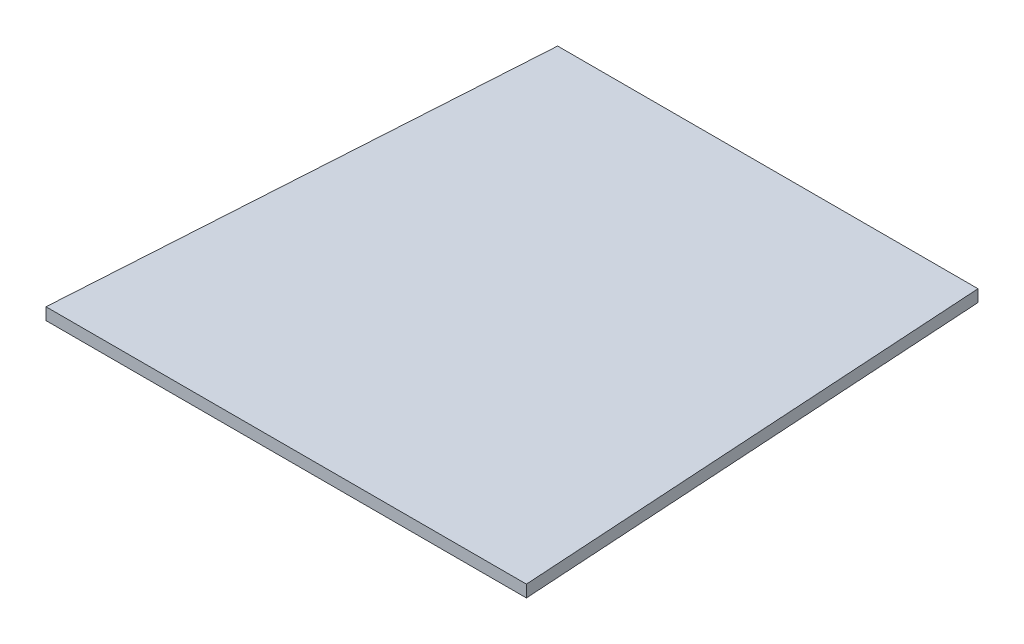
ISO-10303-21;
HEADER;
FILE_DESCRIPTION(('STEP AP214'),'2;1');
FILE_NAME('part.step','',(''),(''),'','','');
FILE_SCHEMA(('AUTOMOTIVE_DESIGN { 1 0 10303 214 1 1 1 1 }'));
ENDSEC;
DATA;
#1=APPLICATION_CONTEXT('core data for automotive mechanical design processes');
#2=APPLICATION_PROTOCOL_DEFINITION('international standard','automotive_design',2000,#1);
#3=PRODUCT_CONTEXT('',#1,'mechanical');
#4=PRODUCT('Part','Part','',(#3));
#5=PRODUCT_RELATED_PRODUCT_CATEGORY('part','',(#4));
#6=PRODUCT_DEFINITION_FORMATION('','',#4);
#7=PRODUCT_DEFINITION_CONTEXT('part definition',#1,'design');
#8=PRODUCT_DEFINITION('design','',#6,#7);
#9=PRODUCT_DEFINITION_SHAPE('','',#8);
#10=(LENGTH_UNIT() NAMED_UNIT(*) SI_UNIT(.MILLI.,.METRE.));
#11=(NAMED_UNIT(*) PLANE_ANGLE_UNIT() SI_UNIT($,.RADIAN.));
#12=(NAMED_UNIT(*) SI_UNIT($,.STERADIAN.) SOLID_ANGLE_UNIT());
#13=UNCERTAINTY_MEASURE_WITH_UNIT(LENGTH_MEASURE(1.E-05),#10,'distance_accuracy_value','');
#14=(GEOMETRIC_REPRESENTATION_CONTEXT(3) GLOBAL_UNCERTAINTY_ASSIGNED_CONTEXT((#13)) GLOBAL_UNIT_ASSIGNED_CONTEXT((#10,
#11,#12)) REPRESENTATION_CONTEXT('',''));
#15=CARTESIAN_POINT('',(0.,0.,0.));
#16=DIRECTION('',(0.,0.,1.));
#17=DIRECTION('',(1.,0.,0.));
#18=AXIS2_PLACEMENT_3D('',#15,#16,#17);
#19=CARTESIAN_POINT('',(200.,10.,138.961038961039));
#20=DIRECTION('',(0.,0.,-1.));
#21=DIRECTION('',(-1.,0.,0.));
#22=AXIS2_PLACEMENT_3D('',#19,#20,#21);
#23=PLANE('',#22);
#24=DIRECTION('',(1.,0.,0.));
#25=VECTOR('',#24,1.);
#26=CARTESIAN_POINT('',(200.,0.,138.961038961039));
#27=LINE('',#26,#25);
#28=CARTESIAN_POINT('',(-200.,0.,138.961038961039));
#29=VERTEX_POINT('',#28);
#30=CARTESIAN_POINT('',(200.,0.,138.961038961039));
#31=VERTEX_POINT('',#30);
#32=EDGE_CURVE('E125',#29,#31,#27,.T.);
#33=ORIENTED_EDGE('',*,*,#32,.T.);
#34=DIRECTION('',(0.,-1.,0.));
#35=VECTOR('',#34,1.);
#36=CARTESIAN_POINT('',(200.,10.,138.961038961039));
#37=LINE('',#36,#35);
#38=CARTESIAN_POINT('',(200.,10.,138.961038961039));
#39=VERTEX_POINT('',#38);
#40=EDGE_CURVE('E11',#39,#31,#37,.T.);
#41=ORIENTED_EDGE('',*,*,#40,.F.);
#42=DIRECTION('',(1.,0.,0.));
#43=VECTOR('',#42,1.);
#44=CARTESIAN_POINT('',(200.,10.,138.961038961039));
#45=LINE('',#44,#43);
#46=CARTESIAN_POINT('',(-200.,10.,138.961038961039));
#47=VERTEX_POINT('',#46);
#48=EDGE_CURVE('E107',#47,#39,#45,.T.);
#49=ORIENTED_EDGE('',*,*,#48,.F.);
#50=DIRECTION('',(0.,-1.,0.));
#51=VECTOR('',#50,1.);
#52=CARTESIAN_POINT('',(-200.,10.,138.961038961039));
#53=LINE('',#52,#51);
#54=EDGE_CURVE('E121',#47,#29,#53,.T.);
#55=ORIENTED_EDGE('',*,*,#54,.T.);
#56=EDGE_LOOP('',(#33,#41,#49,#55));
#57=FACE_BOUND('',#56,.T.);
#58=ADVANCED_FACE('F47',(#57),#23,.F.);
#59=CARTESIAN_POINT('',(175.,10.,-262.038961038961));
#60=DIRECTION('',(-0.998062251019588,0.,0.0622233323578299));
#61=DIRECTION('',(0.0622233323578299,0.,0.998062251019588));
#62=AXIS2_PLACEMENT_3D('',#59,#60,#61);
#63=PLANE('',#62);
#64=DIRECTION('',(-0.0622233323578299,0.,-0.998062251019588));
#65=VECTOR('',#64,1.);
#66=CARTESIAN_POINT('',(175.,0.,-262.038961038961));
#67=LINE('',#66,#65);
#68=CARTESIAN_POINT('',(175.,0.,-262.038961038961));
#69=VERTEX_POINT('',#68);
#70=EDGE_CURVE('E112',#31,#69,#67,.T.);
#71=ORIENTED_EDGE('',*,*,#70,.T.);
#72=DIRECTION('',(0.,-1.,0.));
#73=VECTOR('',#72,1.);
#74=CARTESIAN_POINT('',(175.,10.,-262.038961038961));
#75=LINE('',#74,#73);
#76=CARTESIAN_POINT('',(175.,10.,-262.038961038961));
#77=VERTEX_POINT('',#76);
#78=EDGE_CURVE('E56',#77,#69,#75,.T.);
#79=ORIENTED_EDGE('',*,*,#78,.F.);
#80=DIRECTION('',(-0.0622233323578299,0.,-0.998062251019588));
#81=VECTOR('',#80,1.);
#82=CARTESIAN_POINT('',(175.,10.,-262.038961038961));
#83=LINE('',#82,#81);
#84=EDGE_CURVE('E102',#39,#77,#83,.T.);
#85=ORIENTED_EDGE('',*,*,#84,.F.);
#86=ORIENTED_EDGE('',*,*,#40,.T.);
#87=EDGE_LOOP('',(#71,#79,#85,#86));
#88=FACE_BOUND('',#87,.T.);
#89=ADVANCED_FACE('F111',(#88),#63,.F.);
#90=CARTESIAN_POINT('',(-175.,10.,-262.038961038961));
#91=DIRECTION('',(0.,0.,1.));
#92=DIRECTION('',(1.,0.,0.));
#93=AXIS2_PLACEMENT_3D('',#90,#91,#92);
#94=PLANE('',#93);
#95=DIRECTION('',(-1.,0.,0.));
#96=VECTOR('',#95,1.);
#97=CARTESIAN_POINT('',(-175.,0.,-262.038961038961));
#98=LINE('',#97,#96);
#99=CARTESIAN_POINT('',(-175.,0.,-262.038961038961));
#100=VERTEX_POINT('',#99);
#101=EDGE_CURVE('E89',#69,#100,#98,.T.);
#102=ORIENTED_EDGE('',*,*,#101,.T.);
#103=DIRECTION('',(0.,-1.,0.));
#104=VECTOR('',#103,1.);
#105=CARTESIAN_POINT('',(-175.,10.,-262.038961038961));
#106=LINE('',#105,#104);
#107=CARTESIAN_POINT('',(-175.,10.,-262.038961038961));
#108=VERTEX_POINT('',#107);
#109=EDGE_CURVE('E114',#108,#100,#106,.T.);
#110=ORIENTED_EDGE('',*,*,#109,.F.);
#111=DIRECTION('',(-1.,0.,0.));
#112=VECTOR('',#111,1.);
#113=CARTESIAN_POINT('',(-175.,10.,-262.038961038961));
#114=LINE('',#113,#112);
#115=EDGE_CURVE('E105',#77,#108,#114,.T.);
#116=ORIENTED_EDGE('',*,*,#115,.F.);
#117=ORIENTED_EDGE('',*,*,#78,.T.);
#118=EDGE_LOOP('',(#102,#110,#116,#117));
#119=FACE_BOUND('',#118,.T.);
#120=ADVANCED_FACE('F115',(#119),#94,.F.);
#121=CARTESIAN_POINT('',(-200.,10.,138.961038961039));
#122=DIRECTION('',(0.998062251019588,0.,0.0622233323578296));
#123=DIRECTION('',(0.0622233323578296,0.,-0.998062251019588));
#124=AXIS2_PLACEMENT_3D('',#121,#122,#123);
#125=PLANE('',#124);
#126=DIRECTION('',(-0.0622233323578296,0.,0.998062251019588));
#127=VECTOR('',#126,1.);
#128=CARTESIAN_POINT('',(-200.,0.,138.961038961039));
#129=LINE('',#128,#127);
#130=EDGE_CURVE('E95',#100,#29,#129,.T.);
#131=ORIENTED_EDGE('',*,*,#130,.T.);
#132=ORIENTED_EDGE('',*,*,#54,.F.);
#133=DIRECTION('',(-0.0622233323578296,0.,0.998062251019588));
#134=VECTOR('',#133,1.);
#135=CARTESIAN_POINT('',(-200.,10.,138.961038961039));
#136=LINE('',#135,#134);
#137=EDGE_CURVE('E67',#108,#47,#136,.T.);
#138=ORIENTED_EDGE('',*,*,#137,.F.);
#139=ORIENTED_EDGE('',*,*,#109,.T.);
#140=EDGE_LOOP('',(#131,#132,#138,#139));
#141=FACE_BOUND('',#140,.T.);
#142=ADVANCED_FACE('F136',(#141),#125,.F.);
#143=CARTESIAN_POINT('',(0.,10.,0.));
#144=DIRECTION('',(0.,-1.,0.));
#145=DIRECTION('',(0.,0.,-1.));
#146=AXIS2_PLACEMENT_3D('',#143,#144,#145);
#147=PLANE('',#146);
#148=ORIENTED_EDGE('',*,*,#48,.T.);
#149=ORIENTED_EDGE('',*,*,#84,.T.);
#150=ORIENTED_EDGE('',*,*,#115,.T.);
#151=ORIENTED_EDGE('',*,*,#137,.T.);
#152=EDGE_LOOP('',(#148,#149,#150,#151));
#153=FACE_BOUND('',#152,.T.);
#154=ADVANCED_FACE('F103',(#153),#147,.F.);
#155=CARTESIAN_POINT('',(0.,0.,0.));
#156=DIRECTION('',(0.,-1.,0.));
#157=DIRECTION('',(0.,0.,-1.));
#158=AXIS2_PLACEMENT_3D('',#155,#156,#157);
#159=PLANE('',#158);
#160=ORIENTED_EDGE('',*,*,#32,.F.);
#161=ORIENTED_EDGE('',*,*,#130,.F.);
#162=ORIENTED_EDGE('',*,*,#101,.F.);
#163=ORIENTED_EDGE('',*,*,#70,.F.);
#164=EDGE_LOOP('',(#160,#161,#162,#163));
#165=FACE_BOUND('',#164,.T.);
#166=ADVANCED_FACE('F139',(#165),#159,.T.);
#167=CLOSED_SHELL('',(#58,#89,#120,#142,#154,#166));
#168=MANIFOLD_SOLID_BREP('B2',#167);
#169=ADVANCED_BREP_SHAPE_REPRESENTATION('',(#18,#168),#14);
#170=SHAPE_DEFINITION_REPRESENTATION(#9,#169);
ENDSEC;
END-ISO-10303-21;
